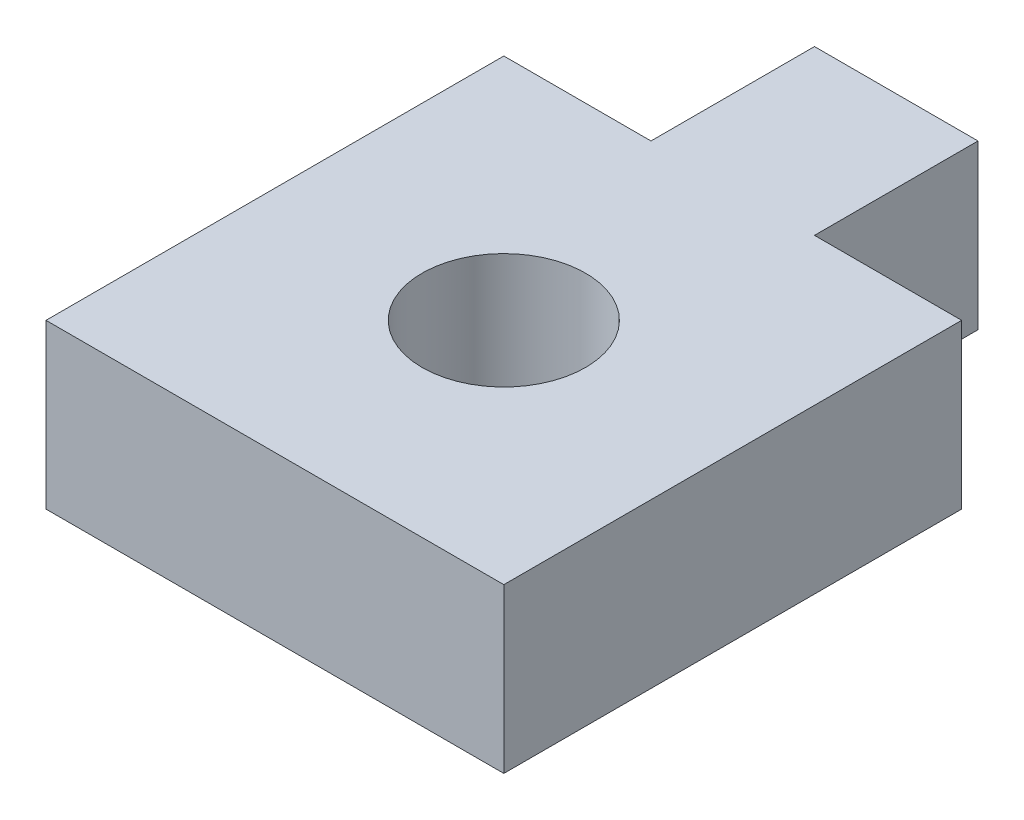
ISO-10303-21;
HEADER;
FILE_DESCRIPTION(('STEP AP214'),'2;1');
FILE_NAME('part.step','',(''),(''),'','','');
FILE_SCHEMA(('AUTOMOTIVE_DESIGN { 1 0 10303 214 1 1 1 1 }'));
ENDSEC;
DATA;
#1=APPLICATION_CONTEXT('core data for automotive mechanical design processes');
#2=APPLICATION_PROTOCOL_DEFINITION('international standard','automotive_design',2000,#1);
#3=PRODUCT_CONTEXT('',#1,'mechanical');
#4=PRODUCT('Part','Part','',(#3));
#5=PRODUCT_RELATED_PRODUCT_CATEGORY('part','',(#4));
#6=PRODUCT_DEFINITION_FORMATION('','',#4);
#7=PRODUCT_DEFINITION_CONTEXT('part definition',#1,'design');
#8=PRODUCT_DEFINITION('design','',#6,#7);
#9=PRODUCT_DEFINITION_SHAPE('','',#8);
#10=(LENGTH_UNIT() NAMED_UNIT(*) SI_UNIT(.MILLI.,.METRE.));
#11=(NAMED_UNIT(*) PLANE_ANGLE_UNIT() SI_UNIT($,.RADIAN.));
#12=(NAMED_UNIT(*) SI_UNIT($,.STERADIAN.) SOLID_ANGLE_UNIT());
#13=UNCERTAINTY_MEASURE_WITH_UNIT(LENGTH_MEASURE(1.E-05),#10,'distance_accuracy_value','');
#14=(GEOMETRIC_REPRESENTATION_CONTEXT(3) GLOBAL_UNCERTAINTY_ASSIGNED_CONTEXT((#13)) GLOBAL_UNIT_ASSIGNED_CONTEXT((#10,
#11,#12)) REPRESENTATION_CONTEXT('',''));
#15=CARTESIAN_POINT('',(0.,0.,0.));
#16=DIRECTION('',(0.,0.,1.));
#17=DIRECTION('',(1.,0.,0.));
#18=AXIS2_PLACEMENT_3D('',#15,#16,#17);
#19=CARTESIAN_POINT('',(0.,6.35,0.));
#20=DIRECTION('',(0.,1.,0.));
#21=DIRECTION('',(0.,0.,1.));
#22=AXIS2_PLACEMENT_3D('',#19,#20,#21);
#23=PLANE('',#22);
#24=DIRECTION('',(1.,0.,0.));
#25=VECTOR('',#24,1.);
#26=CARTESIAN_POINT('',(-17.78,6.35,0.));
#27=LINE('',#26,#25);
#28=CARTESIAN_POINT('',(-17.78,6.35,0.));
#29=VERTEX_POINT('',#28);
#30=CARTESIAN_POINT('',(0.,6.35,0.));
#31=VERTEX_POINT('',#30);
#32=EDGE_CURVE('E152',#29,#31,#27,.T.);
#33=ORIENTED_EDGE('',*,*,#32,.T.);
#34=DIRECTION('',(0.,0.,-1.));
#35=VECTOR('',#34,1.);
#36=CARTESIAN_POINT('',(0.,6.35,0.));
#37=LINE('',#36,#35);
#38=CARTESIAN_POINT('',(0.,6.35,-17.78));
#39=VERTEX_POINT('',#38);
#40=EDGE_CURVE('E100',#31,#39,#37,.T.);
#41=ORIENTED_EDGE('',*,*,#40,.T.);
#42=DIRECTION('',(-1.,0.,0.));
#43=VECTOR('',#42,1.);
#44=CARTESIAN_POINT('',(0.,6.35,-17.78));
#45=LINE('',#44,#43);
#46=CARTESIAN_POINT('',(-5.715,6.35,-17.78));
#47=VERTEX_POINT('',#46);
#48=EDGE_CURVE('E167',#39,#47,#45,.T.);
#49=ORIENTED_EDGE('',*,*,#48,.T.);
#50=DIRECTION('',(0.,0.,-1.));
#51=VECTOR('',#50,1.);
#52=CARTESIAN_POINT('',(-5.715,6.35,-17.78));
#53=LINE('',#52,#51);
#54=CARTESIAN_POINT('',(-5.715,6.35,-24.13));
#55=VERTEX_POINT('',#54);
#56=EDGE_CURVE('E180',#47,#55,#53,.T.);
#57=ORIENTED_EDGE('',*,*,#56,.T.);
#58=DIRECTION('',(-1.,0.,0.));
#59=VECTOR('',#58,1.);
#60=CARTESIAN_POINT('',(-5.715,6.35,-24.13));
#61=LINE('',#60,#59);
#62=CARTESIAN_POINT('',(-12.065,6.35,-24.13));
#63=VERTEX_POINT('',#62);
#64=EDGE_CURVE('E119',#55,#63,#61,.T.);
#65=ORIENTED_EDGE('',*,*,#64,.T.);
#66=DIRECTION('',(0.,0.,1.));
#67=VECTOR('',#66,1.);
#68=CARTESIAN_POINT('',(-12.065,6.35,-24.13));
#69=LINE('',#68,#67);
#70=CARTESIAN_POINT('',(-12.065,6.35,-17.78));
#71=VERTEX_POINT('',#70);
#72=EDGE_CURVE('E113',#63,#71,#69,.T.);
#73=ORIENTED_EDGE('',*,*,#72,.T.);
#74=DIRECTION('',(-1.,0.,0.));
#75=VECTOR('',#74,1.);
#76=CARTESIAN_POINT('',(-12.065,6.35,-17.78));
#77=LINE('',#76,#75);
#78=CARTESIAN_POINT('',(-17.78,6.35,-17.78));
#79=VERTEX_POINT('',#78);
#80=EDGE_CURVE('E117',#71,#79,#77,.T.);
#81=ORIENTED_EDGE('',*,*,#80,.T.);
#82=DIRECTION('',(0.,0.,1.));
#83=VECTOR('',#82,1.);
#84=CARTESIAN_POINT('',(-17.78,6.35,-17.78));
#85=LINE('',#84,#83);
#86=EDGE_CURVE('E57',#79,#29,#85,.T.);
#87=ORIENTED_EDGE('',*,*,#86,.T.);
#88=EDGE_LOOP('',(#33,#41,#49,#57,#65,#73,#81,#87));
#89=FACE_BOUND('',#88,.T.);
#90=CARTESIAN_POINT('',(-8.89,6.35,-8.89));
#91=DIRECTION('',(0.,1.,0.));
#92=DIRECTION('',(0.,0.,1.));
#93=AXIS2_PLACEMENT_3D('',#90,#91,#92);
#94=CIRCLE('',#93,3.175);
#95=CARTESIAN_POINT('',(-8.89,6.35,-5.715));
#96=VERTEX_POINT('',#95);
#97=EDGE_CURVE('E141',#96,#96,#94,.T.);
#98=ORIENTED_EDGE('',*,*,#97,.F.);
#99=EDGE_LOOP('',(#98));
#100=FACE_BOUND('',#99,.T.);
#101=ADVANCED_FACE('F40',(#89,#100),#23,.T.);
#102=CARTESIAN_POINT('',(0.,0.,0.));
#103=DIRECTION('',(0.,1.,0.));
#104=DIRECTION('',(0.,0.,1.));
#105=AXIS2_PLACEMENT_3D('',#102,#103,#104);
#106=PLANE('',#105);
#107=DIRECTION('',(1.,0.,0.));
#108=VECTOR('',#107,1.);
#109=CARTESIAN_POINT('',(-17.78,0.,0.));
#110=LINE('',#109,#108);
#111=CARTESIAN_POINT('',(-17.78,0.,0.));
#112=VERTEX_POINT('',#111);
#113=CARTESIAN_POINT('',(0.,0.,0.));
#114=VERTEX_POINT('',#113);
#115=EDGE_CURVE('E137',#112,#114,#110,.T.);
#116=ORIENTED_EDGE('',*,*,#115,.F.);
#117=DIRECTION('',(0.,0.,1.));
#118=VECTOR('',#117,1.);
#119=CARTESIAN_POINT('',(-17.78,0.,-17.78));
#120=LINE('',#119,#118);
#121=CARTESIAN_POINT('',(-17.78,0.,-17.78));
#122=VERTEX_POINT('',#121);
#123=EDGE_CURVE('E92',#122,#112,#120,.T.);
#124=ORIENTED_EDGE('',*,*,#123,.F.);
#125=DIRECTION('',(-1.,0.,0.));
#126=VECTOR('',#125,1.);
#127=CARTESIAN_POINT('',(-12.065,0.,-17.78));
#128=LINE('',#127,#126);
#129=CARTESIAN_POINT('',(-12.065,0.,-17.78));
#130=VERTEX_POINT('',#129);
#131=EDGE_CURVE('E86',#130,#122,#128,.T.);
#132=ORIENTED_EDGE('',*,*,#131,.F.);
#133=DIRECTION('',(0.,0.,1.));
#134=VECTOR('',#133,1.);
#135=CARTESIAN_POINT('',(-12.065,0.,-24.13));
#136=LINE('',#135,#134);
#137=CARTESIAN_POINT('',(-12.065,0.,-24.13));
#138=VERTEX_POINT('',#137);
#139=EDGE_CURVE('E127',#138,#130,#136,.T.);
#140=ORIENTED_EDGE('',*,*,#139,.F.);
#141=DIRECTION('',(-1.,0.,0.));
#142=VECTOR('',#141,1.);
#143=CARTESIAN_POINT('',(-5.715,0.,-24.13));
#144=LINE('',#143,#142);
#145=CARTESIAN_POINT('',(-5.715,0.,-24.13));
#146=VERTEX_POINT('',#145);
#147=EDGE_CURVE('E147',#146,#138,#144,.T.);
#148=ORIENTED_EDGE('',*,*,#147,.F.);
#149=DIRECTION('',(0.,0.,-1.));
#150=VECTOR('',#149,1.);
#151=CARTESIAN_POINT('',(-5.715,0.,-17.78));
#152=LINE('',#151,#150);
#153=CARTESIAN_POINT('',(-5.715,0.,-17.78));
#154=VERTEX_POINT('',#153);
#155=EDGE_CURVE('E145',#154,#146,#152,.T.);
#156=ORIENTED_EDGE('',*,*,#155,.F.);
#157=DIRECTION('',(-1.,0.,0.));
#158=VECTOR('',#157,1.);
#159=CARTESIAN_POINT('',(0.,0.,-17.78));
#160=LINE('',#159,#158);
#161=CARTESIAN_POINT('',(0.,0.,-17.78));
#162=VERTEX_POINT('',#161);
#163=EDGE_CURVE('E143',#162,#154,#160,.T.);
#164=ORIENTED_EDGE('',*,*,#163,.F.);
#165=DIRECTION('',(0.,0.,-1.));
#166=VECTOR('',#165,1.);
#167=CARTESIAN_POINT('',(0.,0.,0.));
#168=LINE('',#167,#166);
#169=EDGE_CURVE('E140',#114,#162,#168,.T.);
#170=ORIENTED_EDGE('',*,*,#169,.F.);
#171=EDGE_LOOP('',(#116,#124,#132,#140,#148,#156,#164,#170));
#172=FACE_BOUND('',#171,.T.);
#173=CARTESIAN_POINT('',(-8.89,0.,-8.89));
#174=DIRECTION('',(0.,1.,0.));
#175=DIRECTION('',(0.,0.,1.));
#176=AXIS2_PLACEMENT_3D('',#173,#174,#175);
#177=CIRCLE('',#176,3.175);
#178=CARTESIAN_POINT('',(-8.89,0.,-5.715));
#179=VERTEX_POINT('',#178);
#180=EDGE_CURVE('E186',#179,#179,#177,.T.);
#181=ORIENTED_EDGE('',*,*,#180,.T.);
#182=EDGE_LOOP('',(#181));
#183=FACE_BOUND('',#182,.T.);
#184=ADVANCED_FACE('F171',(#172,#183),#106,.F.);
#185=CARTESIAN_POINT('',(-17.78,6.35,0.));
#186=DIRECTION('',(0.,0.,-1.));
#187=DIRECTION('',(-1.,0.,0.));
#188=AXIS2_PLACEMENT_3D('',#185,#186,#187);
#189=PLANE('',#188);
#190=ORIENTED_EDGE('',*,*,#115,.T.);
#191=DIRECTION('',(0.,-1.,0.));
#192=VECTOR('',#191,1.);
#193=CARTESIAN_POINT('',(0.,6.35,0.));
#194=LINE('',#193,#192);
#195=EDGE_CURVE('E11',#31,#114,#194,.T.);
#196=ORIENTED_EDGE('',*,*,#195,.F.);
#197=ORIENTED_EDGE('',*,*,#32,.F.);
#198=DIRECTION('',(0.,-1.,0.));
#199=VECTOR('',#198,1.);
#200=CARTESIAN_POINT('',(-17.78,6.35,0.));
#201=LINE('',#200,#199);
#202=EDGE_CURVE('E133',#29,#112,#201,.T.);
#203=ORIENTED_EDGE('',*,*,#202,.T.);
#204=EDGE_LOOP('',(#190,#196,#197,#203));
#205=FACE_BOUND('',#204,.T.);
#206=ADVANCED_FACE('F42',(#205),#189,.F.);
#207=CARTESIAN_POINT('',(0.,6.35,0.));
#208=DIRECTION('',(-1.,0.,0.));
#209=DIRECTION('',(0.,0.,1.));
#210=AXIS2_PLACEMENT_3D('',#207,#208,#209);
#211=PLANE('',#210);
#212=ORIENTED_EDGE('',*,*,#169,.T.);
#213=DIRECTION('',(0.,-1.,0.));
#214=VECTOR('',#213,1.);
#215=CARTESIAN_POINT('',(0.,6.35,-17.78));
#216=LINE('',#215,#214);
#217=EDGE_CURVE('E49',#39,#162,#216,.T.);
#218=ORIENTED_EDGE('',*,*,#217,.F.);
#219=ORIENTED_EDGE('',*,*,#40,.F.);
#220=ORIENTED_EDGE('',*,*,#195,.T.);
#221=EDGE_LOOP('',(#212,#218,#219,#220));
#222=FACE_BOUND('',#221,.T.);
#223=ADVANCED_FACE('F214',(#222),#211,.F.);
#224=CARTESIAN_POINT('',(0.,6.35,-17.78));
#225=DIRECTION('',(0.,0.,1.));
#226=DIRECTION('',(1.,0.,0.));
#227=AXIS2_PLACEMENT_3D('',#224,#225,#226);
#228=PLANE('',#227);
#229=ORIENTED_EDGE('',*,*,#163,.T.);
#230=DIRECTION('',(0.,-1.,0.));
#231=VECTOR('',#230,1.);
#232=CARTESIAN_POINT('',(-5.715,6.35,-17.78));
#233=LINE('',#232,#231);
#234=EDGE_CURVE('E159',#47,#154,#233,.T.);
#235=ORIENTED_EDGE('',*,*,#234,.F.);
#236=ORIENTED_EDGE('',*,*,#48,.F.);
#237=ORIENTED_EDGE('',*,*,#217,.T.);
#238=EDGE_LOOP('',(#229,#235,#236,#237));
#239=FACE_BOUND('',#238,.T.);
#240=ADVANCED_FACE('F165',(#239),#228,.F.);
#241=CARTESIAN_POINT('',(-5.715,6.35,-17.78));
#242=DIRECTION('',(-1.,0.,0.));
#243=DIRECTION('',(0.,0.,1.));
#244=AXIS2_PLACEMENT_3D('',#241,#242,#243);
#245=PLANE('',#244);
#246=ORIENTED_EDGE('',*,*,#155,.T.);
#247=DIRECTION('',(0.,-1.,0.));
#248=VECTOR('',#247,1.);
#249=CARTESIAN_POINT('',(-5.715,6.35,-24.13));
#250=LINE('',#249,#248);
#251=EDGE_CURVE('E156',#55,#146,#250,.T.);
#252=ORIENTED_EDGE('',*,*,#251,.F.);
#253=ORIENTED_EDGE('',*,*,#56,.F.);
#254=ORIENTED_EDGE('',*,*,#234,.T.);
#255=EDGE_LOOP('',(#246,#252,#253,#254));
#256=FACE_BOUND('',#255,.T.);
#257=ADVANCED_FACE('F176',(#256),#245,.F.);
#258=CARTESIAN_POINT('',(-5.715,6.35,-24.13));
#259=DIRECTION('',(0.,0.,1.));
#260=DIRECTION('',(1.,0.,0.));
#261=AXIS2_PLACEMENT_3D('',#258,#259,#260);
#262=PLANE('',#261);
#263=ORIENTED_EDGE('',*,*,#147,.T.);
#264=DIRECTION('',(0.,-1.,0.));
#265=VECTOR('',#264,1.);
#266=CARTESIAN_POINT('',(-12.065,6.35,-24.13));
#267=LINE('',#266,#265);
#268=EDGE_CURVE('E128',#63,#138,#267,.T.);
#269=ORIENTED_EDGE('',*,*,#268,.F.);
#270=ORIENTED_EDGE('',*,*,#64,.F.);
#271=ORIENTED_EDGE('',*,*,#251,.T.);
#272=EDGE_LOOP('',(#263,#269,#270,#271));
#273=FACE_BOUND('',#272,.T.);
#274=ADVANCED_FACE('F179',(#273),#262,.F.);
#275=CARTESIAN_POINT('',(-12.065,6.35,-24.13));
#276=DIRECTION('',(1.,0.,0.));
#277=DIRECTION('',(0.,0.,-1.));
#278=AXIS2_PLACEMENT_3D('',#275,#276,#277);
#279=PLANE('',#278);
#280=ORIENTED_EDGE('',*,*,#139,.T.);
#281=DIRECTION('',(0.,-1.,0.));
#282=VECTOR('',#281,1.);
#283=CARTESIAN_POINT('',(-12.065,6.35,-17.78));
#284=LINE('',#283,#282);
#285=EDGE_CURVE('E124',#71,#130,#284,.T.);
#286=ORIENTED_EDGE('',*,*,#285,.F.);
#287=ORIENTED_EDGE('',*,*,#72,.F.);
#288=ORIENTED_EDGE('',*,*,#268,.T.);
#289=EDGE_LOOP('',(#280,#286,#287,#288));
#290=FACE_BOUND('',#289,.T.);
#291=ADVANCED_FACE('F125',(#290),#279,.F.);
#292=CARTESIAN_POINT('',(-12.065,6.35,-17.78));
#293=DIRECTION('',(0.,0.,1.));
#294=DIRECTION('',(1.,0.,0.));
#295=AXIS2_PLACEMENT_3D('',#292,#293,#294);
#296=PLANE('',#295);
#297=ORIENTED_EDGE('',*,*,#131,.T.);
#298=DIRECTION('',(0.,-1.,0.));
#299=VECTOR('',#298,1.);
#300=CARTESIAN_POINT('',(-17.78,6.35,-17.78));
#301=LINE('',#300,#299);
#302=EDGE_CURVE('E129',#79,#122,#301,.T.);
#303=ORIENTED_EDGE('',*,*,#302,.F.);
#304=ORIENTED_EDGE('',*,*,#80,.F.);
#305=ORIENTED_EDGE('',*,*,#285,.T.);
#306=EDGE_LOOP('',(#297,#303,#304,#305));
#307=FACE_BOUND('',#306,.T.);
#308=ADVANCED_FACE('F131',(#307),#296,.F.);
#309=CARTESIAN_POINT('',(-17.78,6.35,-17.78));
#310=DIRECTION('',(1.,0.,0.));
#311=DIRECTION('',(0.,0.,-1.));
#312=AXIS2_PLACEMENT_3D('',#309,#310,#311);
#313=PLANE('',#312);
#314=ORIENTED_EDGE('',*,*,#123,.T.);
#315=ORIENTED_EDGE('',*,*,#202,.F.);
#316=ORIENTED_EDGE('',*,*,#86,.F.);
#317=ORIENTED_EDGE('',*,*,#302,.T.);
#318=EDGE_LOOP('',(#314,#315,#316,#317));
#319=FACE_BOUND('',#318,.T.);
#320=ADVANCED_FACE('F202',(#319),#313,.F.);
#321=CARTESIAN_POINT('',(-8.89,6.35,-8.89));
#322=DIRECTION('',(0.,-1.,0.));
#323=DIRECTION('',(0.,0.,-1.));
#324=AXIS2_PLACEMENT_3D('',#321,#322,#323);
#325=CYLINDRICAL_SURFACE('',#324,3.175);
#326=ORIENTED_EDGE('',*,*,#97,.T.);
#327=EDGE_LOOP('',(#326));
#328=FACE_BOUND('',#327,.T.);
#329=ORIENTED_EDGE('',*,*,#180,.F.);
#330=EDGE_LOOP('',(#329));
#331=FACE_BOUND('',#330,.T.);
#332=ADVANCED_FACE('F192',(#328,#331),#325,.F.);
#333=CLOSED_SHELL('',(#101,#184,#206,#223,#240,#257,#274,#291,#308,#320,#332));
#334=MANIFOLD_SOLID_BREP('B2',#333);
#335=ADVANCED_BREP_SHAPE_REPRESENTATION('',(#18,#334),#14);
#336=SHAPE_DEFINITION_REPRESENTATION(#9,#335);
ENDSEC;
END-ISO-10303-21;
